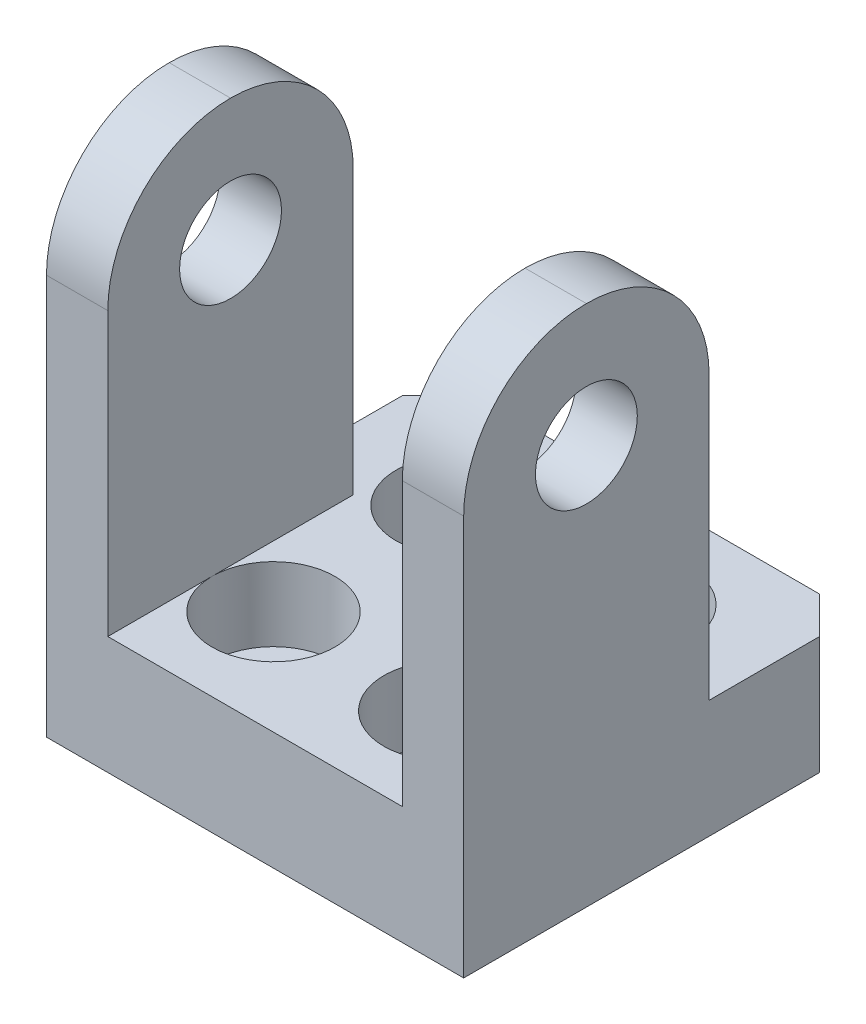
ISO-10303-21;
HEADER;
FILE_DESCRIPTION(('STEP AP214'),'2;1');
FILE_NAME('part.step','',(''),(''),'','','');
FILE_SCHEMA(('AUTOMOTIVE_DESIGN { 1 0 10303 214 1 1 1 1 }'));
ENDSEC;
DATA;
#1=APPLICATION_CONTEXT('core data for automotive mechanical design processes');
#2=APPLICATION_PROTOCOL_DEFINITION('international standard','automotive_design',2000,#1);
#3=PRODUCT_CONTEXT('',#1,'mechanical');
#4=PRODUCT('Part','Part','',(#3));
#5=PRODUCT_RELATED_PRODUCT_CATEGORY('part','',(#4));
#6=PRODUCT_DEFINITION_FORMATION('','',#4);
#7=PRODUCT_DEFINITION_CONTEXT('part definition',#1,'design');
#8=PRODUCT_DEFINITION('design','',#6,#7);
#9=PRODUCT_DEFINITION_SHAPE('','',#8);
#10=(LENGTH_UNIT() NAMED_UNIT(*) SI_UNIT(.MILLI.,.METRE.));
#11=(NAMED_UNIT(*) PLANE_ANGLE_UNIT() SI_UNIT($,.RADIAN.));
#12=(NAMED_UNIT(*) SI_UNIT($,.STERADIAN.) SOLID_ANGLE_UNIT());
#13=UNCERTAINTY_MEASURE_WITH_UNIT(LENGTH_MEASURE(1.E-05),#10,'distance_accuracy_value','');
#14=(GEOMETRIC_REPRESENTATION_CONTEXT(3) GLOBAL_UNCERTAINTY_ASSIGNED_CONTEXT((#13)) GLOBAL_UNIT_ASSIGNED_CONTEXT((#10,
#11,#12)) REPRESENTATION_CONTEXT('',''));
#15=CARTESIAN_POINT('',(0.,0.,0.));
#16=DIRECTION('',(0.,0.,1.));
#17=DIRECTION('',(1.,0.,0.));
#18=AXIS2_PLACEMENT_3D('',#15,#16,#17);
#19=CARTESIAN_POINT('',(7.,-33.,-13.5));
#20=DIRECTION('',(0.,1.,0.));
#21=DIRECTION('',(0.,0.,1.));
#22=AXIS2_PLACEMENT_3D('',#19,#20,#21);
#23=CYLINDRICAL_SURFACE('',#22,5.);
#24=CARTESIAN_POINT('',(7.,-39.,-13.5));
#25=DIRECTION('',(0.,1.,0.));
#26=DIRECTION('',(0.,0.,1.));
#27=AXIS2_PLACEMENT_3D('',#24,#25,#26);
#28=CIRCLE('',#27,5.);
#29=CARTESIAN_POINT('',(7.,-39.,-8.5));
#30=VERTEX_POINT('',#29);
#31=EDGE_CURVE('E11',#30,#30,#28,.T.);
#32=ORIENTED_EDGE('',*,*,#31,.F.);
#33=EDGE_LOOP('',(#32));
#34=FACE_BOUND('',#33,.T.);
#35=CARTESIAN_POINT('',(7.,-33.,-13.5));
#36=DIRECTION('',(0.,1.,0.));
#37=DIRECTION('',(0.,0.,1.));
#38=AXIS2_PLACEMENT_3D('',#35,#36,#37);
#39=CIRCLE('',#38,5.);
#40=CARTESIAN_POINT('',(7.,-33.,-8.5));
#41=VERTEX_POINT('',#40);
#42=EDGE_CURVE('E255',#41,#41,#39,.T.);
#43=ORIENTED_EDGE('',*,*,#42,.T.);
#44=EDGE_LOOP('',(#43));
#45=FACE_BOUND('',#44,.T.);
#46=ADVANCED_FACE('F17',(#34,#45),#23,.F.);
#47=CARTESIAN_POINT('',(9.75,-39.,-13.5));
#48=DIRECTION('',(0.,-1.,0.));
#49=DIRECTION('',(0.,0.,-1.));
#50=AXIS2_PLACEMENT_3D('',#47,#48,#49);
#51=PLANE('',#50);
#52=CARTESIAN_POINT('',(7.,-39.,-13.5));
#53=DIRECTION('',(0.,1.,0.));
#54=DIRECTION('',(0.,0.,1.));
#55=AXIS2_PLACEMENT_3D('',#52,#53,#54);
#56=CIRCLE('',#55,2.75);
#57=CARTESIAN_POINT('',(7.,-39.,-10.75));
#58=VERTEX_POINT('',#57);
#59=EDGE_CURVE('E20',#58,#58,#56,.T.);
#60=ORIENTED_EDGE('',*,*,#59,.F.);
#61=EDGE_LOOP('',(#60));
#62=FACE_BOUND('',#61,.T.);
#63=ORIENTED_EDGE('',*,*,#31,.T.);
#64=EDGE_LOOP('',(#63));
#65=FACE_BOUND('',#64,.T.);
#66=ADVANCED_FACE('F606',(#62,#65),#51,.F.);
#67=CARTESIAN_POINT('',(7.,-33.,-13.5));
#68=DIRECTION('',(0.,1.,0.));
#69=DIRECTION('',(0.,0.,1.));
#70=AXIS2_PLACEMENT_3D('',#67,#68,#69);
#71=CYLINDRICAL_SURFACE('',#70,2.75);
#72=CARTESIAN_POINT('',(7.,-42.6,-13.5));
#73=DIRECTION('',(0.,1.,0.));
#74=DIRECTION('',(0.,0.,1.));
#75=AXIS2_PLACEMENT_3D('',#72,#73,#74);
#76=CIRCLE('',#75,2.75);
#77=CARTESIAN_POINT('',(7.,-42.6,-10.75));
#78=VERTEX_POINT('',#77);
#79=EDGE_CURVE('E1041',#78,#78,#76,.T.);
#80=ORIENTED_EDGE('',*,*,#79,.F.);
#81=EDGE_LOOP('',(#80));
#82=FACE_BOUND('',#81,.T.);
#83=ORIENTED_EDGE('',*,*,#59,.T.);
#84=EDGE_LOOP('',(#83));
#85=FACE_BOUND('',#84,.T.);
#86=ADVANCED_FACE('F596',(#82,#85),#71,.F.);
#87=CARTESIAN_POINT('',(-7.,-33.,-13.5));
#88=DIRECTION('',(0.,1.,0.));
#89=DIRECTION('',(0.,0.,1.));
#90=AXIS2_PLACEMENT_3D('',#87,#88,#89);
#91=CYLINDRICAL_SURFACE('',#90,5.);
#92=CARTESIAN_POINT('',(-7.,-39.,-13.5));
#93=DIRECTION('',(0.,1.,0.));
#94=DIRECTION('',(0.,0.,1.));
#95=AXIS2_PLACEMENT_3D('',#92,#93,#94);
#96=CIRCLE('',#95,5.);
#97=CARTESIAN_POINT('',(-7.,-39.,-8.5));
#98=VERTEX_POINT('',#97);
#99=EDGE_CURVE('E284',#98,#98,#96,.T.);
#100=ORIENTED_EDGE('',*,*,#99,.F.);
#101=EDGE_LOOP('',(#100));
#102=FACE_BOUND('',#101,.T.);
#103=CARTESIAN_POINT('',(-7.,-33.,-13.5));
#104=DIRECTION('',(0.,1.,0.));
#105=DIRECTION('',(0.,0.,1.));
#106=AXIS2_PLACEMENT_3D('',#103,#104,#105);
#107=CIRCLE('',#106,5.);
#108=CARTESIAN_POINT('',(-7.,-33.,-8.5));
#109=VERTEX_POINT('',#108);
#110=EDGE_CURVE('E258',#109,#109,#107,.T.);
#111=ORIENTED_EDGE('',*,*,#110,.T.);
#112=EDGE_LOOP('',(#111));
#113=FACE_BOUND('',#112,.T.);
#114=ADVANCED_FACE('F585',(#102,#113),#91,.F.);
#115=CARTESIAN_POINT('',(-4.25,-39.,-13.5));
#116=DIRECTION('',(0.,-1.,0.));
#117=DIRECTION('',(0.,0.,-1.));
#118=AXIS2_PLACEMENT_3D('',#115,#116,#117);
#119=PLANE('',#118);
#120=CARTESIAN_POINT('',(-7.,-39.,-13.5));
#121=DIRECTION('',(0.,1.,0.));
#122=DIRECTION('',(0.,0.,1.));
#123=AXIS2_PLACEMENT_3D('',#120,#121,#122);
#124=CIRCLE('',#123,2.75);
#125=CARTESIAN_POINT('',(-7.,-39.,-10.75));
#126=VERTEX_POINT('',#125);
#127=EDGE_CURVE('E282',#126,#126,#124,.T.);
#128=ORIENTED_EDGE('',*,*,#127,.F.);
#129=EDGE_LOOP('',(#128));
#130=FACE_BOUND('',#129,.T.);
#131=ORIENTED_EDGE('',*,*,#99,.T.);
#132=EDGE_LOOP('',(#131));
#133=FACE_BOUND('',#132,.T.);
#134=ADVANCED_FACE('F575',(#130,#133),#119,.F.);
#135=CARTESIAN_POINT('',(-7.,-33.,-13.5));
#136=DIRECTION('',(0.,1.,0.));
#137=DIRECTION('',(0.,0.,1.));
#138=AXIS2_PLACEMENT_3D('',#135,#136,#137);
#139=CYLINDRICAL_SURFACE('',#138,2.75);
#140=CARTESIAN_POINT('',(-7.,-42.6,-13.5));
#141=DIRECTION('',(0.,1.,0.));
#142=DIRECTION('',(0.,0.,1.));
#143=AXIS2_PLACEMENT_3D('',#140,#141,#142);
#144=CIRCLE('',#143,2.75);
#145=CARTESIAN_POINT('',(-7.,-42.6,-10.75));
#146=VERTEX_POINT('',#145);
#147=EDGE_CURVE('E1037',#146,#146,#144,.T.);
#148=ORIENTED_EDGE('',*,*,#147,.F.);
#149=EDGE_LOOP('',(#148));
#150=FACE_BOUND('',#149,.T.);
#151=ORIENTED_EDGE('',*,*,#127,.T.);
#152=EDGE_LOOP('',(#151));
#153=FACE_BOUND('',#152,.T.);
#154=ADVANCED_FACE('F564',(#150,#153),#139,.F.);
#155=CARTESIAN_POINT('',(7.,-33.,1.5));
#156=DIRECTION('',(0.,1.,0.));
#157=DIRECTION('',(0.,0.,1.));
#158=AXIS2_PLACEMENT_3D('',#155,#156,#157);
#159=CYLINDRICAL_SURFACE('',#158,5.);
#160=CARTESIAN_POINT('',(7.,-39.,1.5));
#161=DIRECTION('',(0.,1.,0.));
#162=DIRECTION('',(0.,0.,1.));
#163=AXIS2_PLACEMENT_3D('',#160,#161,#162);
#164=CIRCLE('',#163,5.);
#165=CARTESIAN_POINT('',(7.,-39.,6.5));
#166=VERTEX_POINT('',#165);
#167=EDGE_CURVE('E281',#166,#166,#164,.T.);
#168=ORIENTED_EDGE('',*,*,#167,.F.);
#169=EDGE_LOOP('',(#168));
#170=FACE_BOUND('',#169,.T.);
#171=CARTESIAN_POINT('',(7.,-33.,1.5));
#172=DIRECTION('',(0.,1.,0.));
#173=DIRECTION('',(0.,0.,1.));
#174=AXIS2_PLACEMENT_3D('',#171,#172,#173);
#175=CIRCLE('',#174,5.);
#176=CARTESIAN_POINT('',(12.,-33.,1.5));
#177=VERTEX_POINT('',#176);
#178=EDGE_CURVE('E235',#177,#177,#175,.T.);
#179=ORIENTED_EDGE('',*,*,#178,.T.);
#180=EDGE_LOOP('',(#179));
#181=FACE_BOUND('',#180,.T.);
#182=ADVANCED_FACE('F553',(#170,#181),#159,.F.);
#183=CARTESIAN_POINT('',(9.75,-39.,1.5));
#184=DIRECTION('',(0.,-1.,0.));
#185=DIRECTION('',(0.,0.,-1.));
#186=AXIS2_PLACEMENT_3D('',#183,#184,#185);
#187=PLANE('',#186);
#188=CARTESIAN_POINT('',(7.,-39.,1.5));
#189=DIRECTION('',(0.,1.,0.));
#190=DIRECTION('',(0.,0.,1.));
#191=AXIS2_PLACEMENT_3D('',#188,#189,#190);
#192=CIRCLE('',#191,2.75);
#193=CARTESIAN_POINT('',(7.,-39.,4.25));
#194=VERTEX_POINT('',#193);
#195=EDGE_CURVE('E278',#194,#194,#192,.T.);
#196=ORIENTED_EDGE('',*,*,#195,.F.);
#197=EDGE_LOOP('',(#196));
#198=FACE_BOUND('',#197,.T.);
#199=ORIENTED_EDGE('',*,*,#167,.T.);
#200=EDGE_LOOP('',(#199));
#201=FACE_BOUND('',#200,.T.);
#202=ADVANCED_FACE('F542',(#198,#201),#187,.F.);
#203=CARTESIAN_POINT('',(7.,-33.,1.5));
#204=DIRECTION('',(0.,1.,0.));
#205=DIRECTION('',(0.,0.,1.));
#206=AXIS2_PLACEMENT_3D('',#203,#204,#205);
#207=CYLINDRICAL_SURFACE('',#206,2.75);
#208=CARTESIAN_POINT('',(7.,-42.6,1.5));
#209=DIRECTION('',(0.,1.,0.));
#210=DIRECTION('',(0.,0.,1.));
#211=AXIS2_PLACEMENT_3D('',#208,#209,#210);
#212=CIRCLE('',#211,2.75);
#213=CARTESIAN_POINT('',(7.,-42.6,4.25));
#214=VERTEX_POINT('',#213);
#215=EDGE_CURVE('E1024',#214,#214,#212,.T.);
#216=ORIENTED_EDGE('',*,*,#215,.F.);
#217=EDGE_LOOP('',(#216));
#218=FACE_BOUND('',#217,.T.);
#219=ORIENTED_EDGE('',*,*,#195,.T.);
#220=EDGE_LOOP('',(#219));
#221=FACE_BOUND('',#220,.T.);
#222=ADVANCED_FACE('F531',(#218,#221),#207,.F.);
#223=CARTESIAN_POINT('',(-7.,-33.,1.5));
#224=DIRECTION('',(0.,1.,0.));
#225=DIRECTION('',(0.,0.,1.));
#226=AXIS2_PLACEMENT_3D('',#223,#224,#225);
#227=CYLINDRICAL_SURFACE('',#226,5.);
#228=CARTESIAN_POINT('',(-7.,-39.,1.5));
#229=DIRECTION('',(0.,1.,0.));
#230=DIRECTION('',(0.,0.,1.));
#231=AXIS2_PLACEMENT_3D('',#228,#229,#230);
#232=CIRCLE('',#231,5.);
#233=CARTESIAN_POINT('',(-7.,-39.,6.5));
#234=VERTEX_POINT('',#233);
#235=EDGE_CURVE('E275',#234,#234,#232,.T.);
#236=ORIENTED_EDGE('',*,*,#235,.F.);
#237=EDGE_LOOP('',(#236));
#238=FACE_BOUND('',#237,.T.);
#239=CARTESIAN_POINT('',(-7.,-33.,1.5));
#240=DIRECTION('',(0.,1.,0.));
#241=DIRECTION('',(0.,0.,1.));
#242=AXIS2_PLACEMENT_3D('',#239,#240,#241);
#243=CIRCLE('',#242,5.);
#244=CARTESIAN_POINT('',(-12.,-33.,1.5));
#245=VERTEX_POINT('',#244);
#246=EDGE_CURVE('E259',#245,#245,#243,.T.);
#247=ORIENTED_EDGE('',*,*,#246,.T.);
#248=EDGE_LOOP('',(#247));
#249=FACE_BOUND('',#248,.T.);
#250=ADVANCED_FACE('F520',(#238,#249),#227,.F.);
#251=CARTESIAN_POINT('',(-4.25,-39.,1.5));
#252=DIRECTION('',(0.,-1.,0.));
#253=DIRECTION('',(0.,0.,-1.));
#254=AXIS2_PLACEMENT_3D('',#251,#252,#253);
#255=PLANE('',#254);
#256=CARTESIAN_POINT('',(-7.,-39.,1.5));
#257=DIRECTION('',(0.,1.,0.));
#258=DIRECTION('',(0.,0.,1.));
#259=AXIS2_PLACEMENT_3D('',#256,#257,#258);
#260=CIRCLE('',#259,2.75);
#261=CARTESIAN_POINT('',(-7.,-39.,4.25));
#262=VERTEX_POINT('',#261);
#263=EDGE_CURVE('E272',#262,#262,#260,.T.);
#264=ORIENTED_EDGE('',*,*,#263,.F.);
#265=EDGE_LOOP('',(#264));
#266=FACE_BOUND('',#265,.T.);
#267=ORIENTED_EDGE('',*,*,#235,.T.);
#268=EDGE_LOOP('',(#267));
#269=FACE_BOUND('',#268,.T.);
#270=ADVANCED_FACE('F509',(#266,#269),#255,.F.);
#271=CARTESIAN_POINT('',(-7.,-33.,1.5));
#272=DIRECTION('',(0.,1.,0.));
#273=DIRECTION('',(0.,0.,1.));
#274=AXIS2_PLACEMENT_3D('',#271,#272,#273);
#275=CYLINDRICAL_SURFACE('',#274,2.75);
#276=CARTESIAN_POINT('',(-7.,-42.6,1.5));
#277=DIRECTION('',(0.,1.,0.));
#278=DIRECTION('',(0.,0.,1.));
#279=AXIS2_PLACEMENT_3D('',#276,#277,#278);
#280=CIRCLE('',#279,2.75);
#281=CARTESIAN_POINT('',(-7.,-42.6,4.25));
#282=VERTEX_POINT('',#281);
#283=EDGE_CURVE('E1017',#282,#282,#280,.T.);
#284=ORIENTED_EDGE('',*,*,#283,.F.);
#285=EDGE_LOOP('',(#284));
#286=FACE_BOUND('',#285,.T.);
#287=ORIENTED_EDGE('',*,*,#263,.T.);
#288=EDGE_LOOP('',(#287));
#289=FACE_BOUND('',#288,.T.);
#290=ADVANCED_FACE('F498',(#286,#289),#275,.F.);
#291=CARTESIAN_POINT('',(-17.,-42.6,-19.));
#292=DIRECTION('',(0.707106781186546,0.,0.707106781186549));
#293=DIRECTION('',(0.,-1.,0.));
#294=AXIS2_PLACEMENT_3D('',#291,#292,#293);
#295=PLANE('',#294);
#296=DIRECTION('',(-0.707106781186549,0.,0.707106781186546));
#297=VECTOR('',#296,1.);
#298=CARTESIAN_POINT('',(-18.,-33.,-18.));
#299=LINE('',#298,#297);
#300=CARTESIAN_POINT('',(-14.,-33.,-22.));
#301=VERTEX_POINT('',#300);
#302=CARTESIAN_POINT('',(-17.,-33.,-19.));
#303=VERTEX_POINT('',#302);
#304=EDGE_CURVE('E254',#301,#303,#299,.T.);
#305=ORIENTED_EDGE('',*,*,#304,.F.);
#306=DIRECTION('',(0.,1.,0.));
#307=VECTOR('',#306,1.);
#308=CARTESIAN_POINT('',(-14.,13.690470119715,-22.));
#309=LINE('',#308,#307);
#310=CARTESIAN_POINT('',(-14.,-42.6,-22.));
#311=VERTEX_POINT('',#310);
#312=EDGE_CURVE('E269',#311,#301,#309,.T.);
#313=ORIENTED_EDGE('',*,*,#312,.F.);
#314=DIRECTION('',(0.707106781186549,0.,-0.707106781186546));
#315=VECTOR('',#314,1.);
#316=CARTESIAN_POINT('',(-17.,-42.6,-19.));
#317=LINE('',#316,#315);
#318=CARTESIAN_POINT('',(-17.,-42.6,-19.));
#319=VERTEX_POINT('',#318);
#320=EDGE_CURVE('E1045',#319,#311,#317,.T.);
#321=ORIENTED_EDGE('',*,*,#320,.F.);
#322=DIRECTION('',(0.,-1.,0.));
#323=VECTOR('',#322,1.);
#324=CARTESIAN_POINT('',(-17.,-42.6,-19.));
#325=LINE('',#324,#323);
#326=EDGE_CURVE('E1248',#303,#319,#325,.T.);
#327=ORIENTED_EDGE('',*,*,#326,.F.);
#328=EDGE_LOOP('',(#305,#313,#321,#327));
#329=FACE_BOUND('',#328,.T.);
#330=ADVANCED_FACE('F488',(#329),#295,.F.);
#331=CARTESIAN_POINT('',(14.,13.690470119715,-22.));
#332=DIRECTION('',(-0.707106781186549,0.,0.707106781186546));
#333=DIRECTION('',(0.,1.,0.));
#334=AXIS2_PLACEMENT_3D('',#331,#332,#333);
#335=PLANE('',#334);
#336=DIRECTION('',(-0.707106781186546,0.,-0.707106781186549));
#337=VECTOR('',#336,1.);
#338=CARTESIAN_POINT('',(18.,-33.,-18.));
#339=LINE('',#338,#337);
#340=CARTESIAN_POINT('',(17.,-33.,-19.));
#341=VERTEX_POINT('',#340);
#342=CARTESIAN_POINT('',(14.,-33.,-22.));
#343=VERTEX_POINT('',#342);
#344=EDGE_CURVE('E243',#341,#343,#339,.T.);
#345=ORIENTED_EDGE('',*,*,#344,.F.);
#346=DIRECTION('',(0.,1.,0.));
#347=VECTOR('',#346,1.);
#348=CARTESIAN_POINT('',(17.,-42.6,-19.));
#349=LINE('',#348,#347);
#350=CARTESIAN_POINT('',(17.,-42.6,-19.));
#351=VERTEX_POINT('',#350);
#352=EDGE_CURVE('E1157',#351,#341,#349,.T.);
#353=ORIENTED_EDGE('',*,*,#352,.F.);
#354=DIRECTION('',(0.707106781186546,0.,0.707106781186549));
#355=VECTOR('',#354,1.);
#356=CARTESIAN_POINT('',(14.,-42.6,-22.));
#357=LINE('',#356,#355);
#358=CARTESIAN_POINT('',(14.,-42.6,-22.));
#359=VERTEX_POINT('',#358);
#360=EDGE_CURVE('E1049',#359,#351,#357,.T.);
#361=ORIENTED_EDGE('',*,*,#360,.F.);
#362=DIRECTION('',(0.,-1.,0.));
#363=VECTOR('',#362,1.);
#364=CARTESIAN_POINT('',(14.,13.690470119715,-22.));
#365=LINE('',#364,#363);
#366=EDGE_CURVE('E266',#343,#359,#365,.T.);
#367=ORIENTED_EDGE('',*,*,#366,.F.);
#368=EDGE_LOOP('',(#345,#353,#361,#367));
#369=FACE_BOUND('',#368,.T.);
#370=ADVANCED_FACE('F477',(#369),#335,.F.);
#371=CARTESIAN_POINT('',(-17.,13.690470119715,-22.));
#372=DIRECTION('',(0.,0.,-1.));
#373=DIRECTION('',(0.,-1.,0.));
#374=AXIS2_PLACEMENT_3D('',#371,#372,#373);
#375=PLANE('',#374);
#376=DIRECTION('',(1.,0.,0.));
#377=VECTOR('',#376,1.);
#378=CARTESIAN_POINT('',(-17.,-33.,-22.));
#379=LINE('',#378,#377);
#380=EDGE_CURVE('E250',#301,#343,#379,.T.);
#381=ORIENTED_EDGE('',*,*,#380,.T.);
#382=ORIENTED_EDGE('',*,*,#366,.T.);
#383=DIRECTION('',(1.,0.,0.));
#384=VECTOR('',#383,1.);
#385=CARTESIAN_POINT('',(-17.,-42.6,-22.));
#386=LINE('',#385,#384);
#387=EDGE_CURVE('E1053',#311,#359,#386,.T.);
#388=ORIENTED_EDGE('',*,*,#387,.F.);
#389=ORIENTED_EDGE('',*,*,#312,.T.);
#390=EDGE_LOOP('',(#381,#382,#388,#389));
#391=FACE_BOUND('',#390,.T.);
#392=ADVANCED_FACE('F466',(#391),#375,.T.);
#393=CARTESIAN_POINT('',(0.,-10.,0.));
#394=DIRECTION('',(1.,0.,0.));
#395=DIRECTION('',(0.,0.,-1.));
#396=AXIS2_PLACEMENT_3D('',#393,#394,#395);
#397=CYLINDRICAL_SURFACE('',#396,10.);
#398=CARTESIAN_POINT('',(-17.,-10.,0.));
#399=DIRECTION('',(-1.,0.,0.));
#400=DIRECTION('',(0.,0.,1.));
#401=AXIS2_PLACEMENT_3D('',#398,#399,#400);
#402=CIRCLE('',#401,10.);
#403=CARTESIAN_POINT('',(-17.,-10.,10.));
#404=VERTEX_POINT('',#403);
#405=CARTESIAN_POINT('',(-17.,0.,0.));
#406=VERTEX_POINT('',#405);
#407=EDGE_CURVE('E1224',#404,#406,#402,.T.);
#408=ORIENTED_EDGE('',*,*,#407,.F.);
#409=DIRECTION('',(-1.,0.,0.));
#410=VECTOR('',#409,1.);
#411=CARTESIAN_POINT('',(17.,-10.,10.));
#412=LINE('',#411,#410);
#413=CARTESIAN_POINT('',(-12.,-10.,10.));
#414=VERTEX_POINT('',#413);
#415=EDGE_CURVE('E1095',#414,#404,#412,.T.);
#416=ORIENTED_EDGE('',*,*,#415,.F.);
#417=CARTESIAN_POINT('',(-12.,-10.,0.));
#418=DIRECTION('',(1.,0.,0.));
#419=DIRECTION('',(0.,0.,1.));
#420=AXIS2_PLACEMENT_3D('',#417,#418,#419);
#421=CIRCLE('',#420,10.);
#422=CARTESIAN_POINT('',(-12.,0.,0.));
#423=VERTEX_POINT('',#422);
#424=EDGE_CURVE('E1002',#423,#414,#421,.T.);
#425=ORIENTED_EDGE('',*,*,#424,.F.);
#426=DIRECTION('',(-1.,0.,0.));
#427=VECTOR('',#426,1.);
#428=CARTESIAN_POINT('',(0.,0.,0.));
#429=LINE('',#428,#427);
#430=EDGE_CURVE('E262',#423,#406,#429,.T.);
#431=ORIENTED_EDGE('',*,*,#430,.T.);
#432=EDGE_LOOP('',(#408,#416,#425,#431));
#433=FACE_BOUND('',#432,.T.);
#434=ADVANCED_FACE('F455',(#433),#397,.T.);
#435=CARTESIAN_POINT('',(0.,-10.,0.));
#436=DIRECTION('',(1.,0.,0.));
#437=DIRECTION('',(0.,0.,-1.));
#438=AXIS2_PLACEMENT_3D('',#435,#436,#437);
#439=CYLINDRICAL_SURFACE('',#438,10.);
#440=CARTESIAN_POINT('',(12.,-10.,0.));
#441=DIRECTION('',(-1.,0.,0.));
#442=DIRECTION('',(0.,0.,-1.));
#443=AXIS2_PLACEMENT_3D('',#440,#441,#442);
#444=CIRCLE('',#443,10.);
#445=CARTESIAN_POINT('',(12.,-10.,10.));
#446=VERTEX_POINT('',#445);
#447=CARTESIAN_POINT('',(12.,0.,0.));
#448=VERTEX_POINT('',#447);
#449=EDGE_CURVE('E985',#446,#448,#444,.T.);
#450=ORIENTED_EDGE('',*,*,#449,.F.);
#451=DIRECTION('',(-1.,0.,0.));
#452=VECTOR('',#451,1.);
#453=CARTESIAN_POINT('',(17.,-10.,10.));
#454=LINE('',#453,#452);
#455=CARTESIAN_POINT('',(17.,-10.,10.));
#456=VERTEX_POINT('',#455);
#457=EDGE_CURVE('E1077',#456,#446,#454,.T.);
#458=ORIENTED_EDGE('',*,*,#457,.F.);
#459=CARTESIAN_POINT('',(17.,-10.,0.));
#460=DIRECTION('',(1.,0.,0.));
#461=DIRECTION('',(0.,0.,-1.));
#462=AXIS2_PLACEMENT_3D('',#459,#460,#461);
#463=CIRCLE('',#462,10.);
#464=CARTESIAN_POINT('',(17.,0.,0.));
#465=VERTEX_POINT('',#464);
#466=EDGE_CURVE('E1121',#465,#456,#463,.T.);
#467=ORIENTED_EDGE('',*,*,#466,.F.);
#468=DIRECTION('',(-1.,0.,0.));
#469=VECTOR('',#468,1.);
#470=CARTESIAN_POINT('',(0.,0.,0.));
#471=LINE('',#470,#469);
#472=EDGE_CURVE('E263',#465,#448,#471,.T.);
#473=ORIENTED_EDGE('',*,*,#472,.T.);
#474=EDGE_LOOP('',(#450,#458,#467,#473));
#475=FACE_BOUND('',#474,.T.);
#476=ADVANCED_FACE('F445',(#475),#439,.T.);
#477=CARTESIAN_POINT('',(0.,-10.,0.));
#478=DIRECTION('',(-1.,0.,0.));
#479=DIRECTION('',(0.,0.,1.));
#480=AXIS2_PLACEMENT_3D('',#477,#478,#479);
#481=CYLINDRICAL_SURFACE('',#480,10.);
#482=DIRECTION('',(1.,0.,0.));
#483=VECTOR('',#482,1.);
#484=CARTESIAN_POINT('',(17.,-10.,-10.));
#485=LINE('',#484,#483);
#486=CARTESIAN_POINT('',(12.,-10.,-10.));
#487=VERTEX_POINT('',#486);
#488=CARTESIAN_POINT('',(17.,-10.,-10.));
#489=VERTEX_POINT('',#488);
#490=EDGE_CURVE('E1173',#487,#489,#485,.T.);
#491=ORIENTED_EDGE('',*,*,#490,.F.);
#492=CARTESIAN_POINT('',(12.,-10.,0.));
#493=DIRECTION('',(-1.,0.,0.));
#494=DIRECTION('',(0.,0.,-1.));
#495=AXIS2_PLACEMENT_3D('',#492,#493,#494);
#496=CIRCLE('',#495,10.);
#497=EDGE_CURVE('E979',#448,#487,#496,.T.);
#498=ORIENTED_EDGE('',*,*,#497,.F.);
#499=ORIENTED_EDGE('',*,*,#472,.F.);
#500=CARTESIAN_POINT('',(17.,-10.,0.));
#501=DIRECTION('',(1.,0.,0.));
#502=DIRECTION('',(0.,0.,-1.));
#503=AXIS2_PLACEMENT_3D('',#500,#501,#502);
#504=CIRCLE('',#503,10.);
#505=EDGE_CURVE('E1142',#489,#465,#504,.T.);
#506=ORIENTED_EDGE('',*,*,#505,.F.);
#507=EDGE_LOOP('',(#491,#498,#499,#506));
#508=FACE_BOUND('',#507,.T.);
#509=ADVANCED_FACE('F435',(#508),#481,.T.);
#510=CARTESIAN_POINT('',(0.,-10.,0.));
#511=DIRECTION('',(-1.,0.,0.));
#512=DIRECTION('',(0.,0.,1.));
#513=AXIS2_PLACEMENT_3D('',#510,#511,#512);
#514=CYLINDRICAL_SURFACE('',#513,10.);
#515=CARTESIAN_POINT('',(-12.,-10.,0.));
#516=DIRECTION('',(1.,0.,0.));
#517=DIRECTION('',(0.,0.,1.));
#518=AXIS2_PLACEMENT_3D('',#515,#516,#517);
#519=CIRCLE('',#518,10.);
#520=CARTESIAN_POINT('',(-12.,-10.,-10.));
#521=VERTEX_POINT('',#520);
#522=EDGE_CURVE('E1009',#521,#423,#519,.T.);
#523=ORIENTED_EDGE('',*,*,#522,.F.);
#524=DIRECTION('',(1.,0.,0.));
#525=VECTOR('',#524,1.);
#526=CARTESIAN_POINT('',(17.,-10.,-10.));
#527=LINE('',#526,#525);
#528=CARTESIAN_POINT('',(-17.,-10.,-10.));
#529=VERTEX_POINT('',#528);
#530=EDGE_CURVE('E1272',#529,#521,#527,.T.);
#531=ORIENTED_EDGE('',*,*,#530,.F.);
#532=CARTESIAN_POINT('',(-17.,-10.,0.));
#533=DIRECTION('',(-1.,0.,0.));
#534=DIRECTION('',(0.,0.,1.));
#535=AXIS2_PLACEMENT_3D('',#532,#533,#534);
#536=CIRCLE('',#535,10.);
#537=EDGE_CURVE('E1220',#406,#529,#536,.T.);
#538=ORIENTED_EDGE('',*,*,#537,.F.);
#539=ORIENTED_EDGE('',*,*,#430,.F.);
#540=EDGE_LOOP('',(#523,#531,#538,#539));
#541=FACE_BOUND('',#540,.T.);
#542=ADVANCED_FACE('F423',(#541),#514,.T.);
#543=CARTESIAN_POINT('',(-17.,-10.,0.));
#544=DIRECTION('',(1.,0.,0.));
#545=DIRECTION('',(0.,0.,-1.));
#546=AXIS2_PLACEMENT_3D('',#543,#544,#545);
#547=CYLINDRICAL_SURFACE('',#546,4.15);
#548=CARTESIAN_POINT('',(-17.,-10.,0.));
#549=DIRECTION('',(1.,0.,0.));
#550=DIRECTION('',(0.,0.,-1.));
#551=AXIS2_PLACEMENT_3D('',#548,#549,#550);
#552=CIRCLE('',#551,4.15);
#553=CARTESIAN_POINT('',(-17.,-10.,-4.15));
#554=VERTEX_POINT('',#553);
#555=EDGE_CURVE('E1216',#554,#554,#552,.T.);
#556=ORIENTED_EDGE('',*,*,#555,.F.);
#557=EDGE_LOOP('',(#556));
#558=FACE_BOUND('',#557,.T.);
#559=CARTESIAN_POINT('',(-12.,-10.,0.));
#560=DIRECTION('',(-1.,0.,0.));
#561=DIRECTION('',(0.,0.,1.));
#562=AXIS2_PLACEMENT_3D('',#559,#560,#561);
#563=CIRCLE('',#562,4.15);
#564=CARTESIAN_POINT('',(-12.,-10.,4.15));
#565=VERTEX_POINT('',#564);
#566=EDGE_CURVE('E993',#565,#565,#563,.T.);
#567=ORIENTED_EDGE('',*,*,#566,.F.);
#568=EDGE_LOOP('',(#567));
#569=FACE_BOUND('',#568,.T.);
#570=ADVANCED_FACE('F412',(#558,#569),#547,.F.);
#571=CARTESIAN_POINT('',(-17.,-10.,0.));
#572=DIRECTION('',(1.,0.,0.));
#573=DIRECTION('',(0.,0.,-1.));
#574=AXIS2_PLACEMENT_3D('',#571,#572,#573);
#575=CYLINDRICAL_SURFACE('',#574,4.15);
#576=CARTESIAN_POINT('',(17.,-10.,0.));
#577=DIRECTION('',(1.,0.,0.));
#578=DIRECTION('',(0.,0.,-1.));
#579=AXIS2_PLACEMENT_3D('',#576,#577,#578);
#580=CIRCLE('',#579,4.15);
#581=CARTESIAN_POINT('',(17.,-10.,-4.15));
#582=VERTEX_POINT('',#581);
#583=EDGE_CURVE('E1099',#582,#582,#580,.T.);
#584=ORIENTED_EDGE('',*,*,#583,.T.);
#585=EDGE_LOOP('',(#584));
#586=FACE_BOUND('',#585,.T.);
#587=CARTESIAN_POINT('',(12.,-10.,0.));
#588=DIRECTION('',(1.,0.,0.));
#589=DIRECTION('',(0.,0.,-1.));
#590=AXIS2_PLACEMENT_3D('',#587,#588,#589);
#591=CIRCLE('',#590,4.15);
#592=CARTESIAN_POINT('',(12.,-10.,-4.15));
#593=VERTEX_POINT('',#592);
#594=EDGE_CURVE('E230',#593,#593,#591,.T.);
#595=ORIENTED_EDGE('',*,*,#594,.F.);
#596=EDGE_LOOP('',(#595));
#597=FACE_BOUND('',#596,.T.);
#598=ADVANCED_FACE('F402',(#586,#597),#575,.F.);
#599=CARTESIAN_POINT('',(0.,-33.,0.));
#600=DIRECTION('',(0.,1.,0.));
#601=DIRECTION('',(1.,0.,0.));
#602=AXIS2_PLACEMENT_3D('',#599,#600,#601);
#603=PLANE('',#602);
#604=ORIENTED_EDGE('',*,*,#110,.F.);
#605=EDGE_LOOP('',(#604));
#606=FACE_BOUND('',#605,.T.);
#607=ORIENTED_EDGE('',*,*,#42,.F.);
#608=EDGE_LOOP('',(#607));
#609=FACE_BOUND('',#608,.T.);
#610=DIRECTION('',(0.,0.,-1.));
#611=VECTOR('',#610,1.);
#612=CARTESIAN_POINT('',(12.,-33.,10.));
#613=LINE('',#612,#611);
#614=CARTESIAN_POINT('',(12.,-33.,10.));
#615=VERTEX_POINT('',#614);
#616=EDGE_CURVE('E236',#615,#177,#613,.T.);
#617=ORIENTED_EDGE('',*,*,#616,.T.);
#618=ORIENTED_EDGE('',*,*,#178,.F.);
#619=DIRECTION('',(0.,0.,-1.));
#620=VECTOR('',#619,1.);
#621=CARTESIAN_POINT('',(12.,-33.,10.));
#622=LINE('',#621,#620);
#623=CARTESIAN_POINT('',(12.,-33.,-10.));
#624=VERTEX_POINT('',#623);
#625=EDGE_CURVE('E246',#177,#624,#622,.T.);
#626=ORIENTED_EDGE('',*,*,#625,.T.);
#627=DIRECTION('',(1.,0.,0.));
#628=VECTOR('',#627,1.);
#629=CARTESIAN_POINT('',(17.,-33.,-10.));
#630=LINE('',#629,#628);
#631=CARTESIAN_POINT('',(17.,-33.,-10.));
#632=VERTEX_POINT('',#631);
#633=EDGE_CURVE('E1188',#624,#632,#630,.T.);
#634=ORIENTED_EDGE('',*,*,#633,.T.);
#635=DIRECTION('',(0.,0.,1.));
#636=VECTOR('',#635,1.);
#637=CARTESIAN_POINT('',(17.,-33.,10.));
#638=LINE('',#637,#636);
#639=EDGE_CURVE('E1150',#341,#632,#638,.T.);
#640=ORIENTED_EDGE('',*,*,#639,.F.);
#641=ORIENTED_EDGE('',*,*,#344,.T.);
#642=ORIENTED_EDGE('',*,*,#380,.F.);
#643=ORIENTED_EDGE('',*,*,#304,.T.);
#644=DIRECTION('',(0.,0.,-1.));
#645=VECTOR('',#644,1.);
#646=CARTESIAN_POINT('',(-17.,-33.,10.));
#647=LINE('',#646,#645);
#648=CARTESIAN_POINT('',(-17.,-33.,-10.));
#649=VERTEX_POINT('',#648);
#650=EDGE_CURVE('E1252',#649,#303,#647,.T.);
#651=ORIENTED_EDGE('',*,*,#650,.F.);
#652=DIRECTION('',(1.,0.,0.));
#653=VECTOR('',#652,1.);
#654=CARTESIAN_POINT('',(17.,-33.,-10.));
#655=LINE('',#654,#653);
#656=CARTESIAN_POINT('',(-12.,-33.,-10.));
#657=VERTEX_POINT('',#656);
#658=EDGE_CURVE('E1308',#649,#657,#655,.T.);
#659=ORIENTED_EDGE('',*,*,#658,.T.);
#660=DIRECTION('',(0.,0.,1.));
#661=VECTOR('',#660,1.);
#662=CARTESIAN_POINT('',(-12.,-33.,10.));
#663=LINE('',#662,#661);
#664=EDGE_CURVE('E1001',#657,#245,#663,.T.);
#665=ORIENTED_EDGE('',*,*,#664,.T.);
#666=ORIENTED_EDGE('',*,*,#246,.F.);
#667=DIRECTION('',(0.,0.,1.));
#668=VECTOR('',#667,1.);
#669=CARTESIAN_POINT('',(-12.,-33.,10.));
#670=LINE('',#669,#668);
#671=CARTESIAN_POINT('',(-12.,-33.,10.));
#672=VERTEX_POINT('',#671);
#673=EDGE_CURVE('E997',#245,#672,#670,.T.);
#674=ORIENTED_EDGE('',*,*,#673,.T.);
#675=DIRECTION('',(1.,0.,0.));
#676=VECTOR('',#675,1.);
#677=CARTESIAN_POINT('',(12.,-33.,10.));
#678=LINE('',#677,#676);
#679=EDGE_CURVE('E1062',#672,#615,#678,.T.);
#680=ORIENTED_EDGE('',*,*,#679,.T.);
#681=EDGE_LOOP('',(#617,#618,#626,#634,#640,#641,#642,#643,#651,#659,#665,#666,#674,#680));
#682=FACE_BOUND('',#681,.T.);
#683=ADVANCED_FACE('F393',(#606,#609,#682),#603,.T.);
#684=CARTESIAN_POINT('',(12.,-33.,10.));
#685=DIRECTION('',(1.,0.,0.));
#686=DIRECTION('',(0.,1.,0.));
#687=AXIS2_PLACEMENT_3D('',#684,#685,#686);
#688=PLANE('',#687);
#689=ORIENTED_EDGE('',*,*,#594,.T.);
#690=EDGE_LOOP('',(#689));
#691=FACE_BOUND('',#690,.T.);
#692=DIRECTION('',(0.,1.,0.));
#693=VECTOR('',#692,1.);
#694=CARTESIAN_POINT('',(12.,-33.,10.));
#695=LINE('',#694,#693);
#696=EDGE_CURVE('E1072',#615,#446,#695,.T.);
#697=ORIENTED_EDGE('',*,*,#696,.T.);
#698=ORIENTED_EDGE('',*,*,#449,.T.);
#699=ORIENTED_EDGE('',*,*,#497,.T.);
#700=DIRECTION('',(0.,1.,0.));
#701=VECTOR('',#700,1.);
#702=CARTESIAN_POINT('',(12.,-33.,-10.));
#703=LINE('',#702,#701);
#704=EDGE_CURVE('E1183',#624,#487,#703,.T.);
#705=ORIENTED_EDGE('',*,*,#704,.F.);
#706=ORIENTED_EDGE('',*,*,#625,.F.);
#707=ORIENTED_EDGE('',*,*,#616,.F.);
#708=EDGE_LOOP('',(#697,#698,#699,#705,#706,#707));
#709=FACE_BOUND('',#708,.T.);
#710=ADVANCED_FACE('F231',(#691,#709),#688,.F.);
#711=CARTESIAN_POINT('',(-12.,-33.,10.));
#712=DIRECTION('',(-1.,0.,0.));
#713=DIRECTION('',(0.,0.,1.));
#714=AXIS2_PLACEMENT_3D('',#711,#712,#713);
#715=PLANE('',#714);
#716=ORIENTED_EDGE('',*,*,#566,.T.);
#717=EDGE_LOOP('',(#716));
#718=FACE_BOUND('',#717,.T.);
#719=ORIENTED_EDGE('',*,*,#522,.T.);
#720=ORIENTED_EDGE('',*,*,#424,.T.);
#721=DIRECTION('',(0.,1.,0.));
#722=VECTOR('',#721,1.);
#723=CARTESIAN_POINT('',(-12.,-33.,10.));
#724=LINE('',#723,#722);
#725=EDGE_CURVE('E1057',#672,#414,#724,.T.);
#726=ORIENTED_EDGE('',*,*,#725,.F.);
#727=ORIENTED_EDGE('',*,*,#673,.F.);
#728=ORIENTED_EDGE('',*,*,#664,.F.);
#729=DIRECTION('',(0.,1.,0.));
#730=VECTOR('',#729,1.);
#731=CARTESIAN_POINT('',(-12.,-33.,-10.));
#732=LINE('',#731,#730);
#733=EDGE_CURVE('E1257',#657,#521,#732,.T.);
#734=ORIENTED_EDGE('',*,*,#733,.T.);
#735=EDGE_LOOP('',(#719,#720,#726,#727,#728,#734));
#736=FACE_BOUND('',#735,.T.);
#737=ADVANCED_FACE('F371',(#718,#736),#715,.F.);
#738=CARTESIAN_POINT('',(0.,-42.6,0.));
#739=DIRECTION('',(0.,1.,0.));
#740=DIRECTION('',(1.,0.,0.));
#741=AXIS2_PLACEMENT_3D('',#738,#739,#740);
#742=PLANE('',#741);
#743=ORIENTED_EDGE('',*,*,#283,.T.);
#744=EDGE_LOOP('',(#743));
#745=FACE_BOUND('',#744,.T.);
#746=ORIENTED_EDGE('',*,*,#215,.T.);
#747=EDGE_LOOP('',(#746));
#748=FACE_BOUND('',#747,.T.);
#749=ORIENTED_EDGE('',*,*,#147,.T.);
#750=EDGE_LOOP('',(#749));
#751=FACE_BOUND('',#750,.T.);
#752=ORIENTED_EDGE('',*,*,#79,.T.);
#753=EDGE_LOOP('',(#752));
#754=FACE_BOUND('',#753,.T.);
#755=ORIENTED_EDGE('',*,*,#387,.T.);
#756=ORIENTED_EDGE('',*,*,#360,.T.);
#757=DIRECTION('',(0.,0.,-1.));
#758=VECTOR('',#757,1.);
#759=CARTESIAN_POINT('',(17.,-42.6,10.));
#760=LINE('',#759,#758);
#761=CARTESIAN_POINT('',(17.,-42.6,10.));
#762=VERTEX_POINT('',#761);
#763=EDGE_CURVE('E1163',#762,#351,#760,.T.);
#764=ORIENTED_EDGE('',*,*,#763,.F.);
#765=DIRECTION('',(1.,0.,0.));
#766=VECTOR('',#765,1.);
#767=CARTESIAN_POINT('',(17.,-42.6,10.));
#768=LINE('',#767,#766);
#769=CARTESIAN_POINT('',(-17.,-42.6,10.));
#770=VERTEX_POINT('',#769);
#771=EDGE_CURVE('E1085',#770,#762,#768,.T.);
#772=ORIENTED_EDGE('',*,*,#771,.F.);
#773=DIRECTION('',(0.,0.,1.));
#774=VECTOR('',#773,1.);
#775=CARTESIAN_POINT('',(-17.,-42.6,10.));
#776=LINE('',#775,#774);
#777=EDGE_CURVE('E1240',#319,#770,#776,.T.);
#778=ORIENTED_EDGE('',*,*,#777,.F.);
#779=ORIENTED_EDGE('',*,*,#320,.T.);
#780=EDGE_LOOP('',(#755,#756,#764,#772,#778,#779));
#781=FACE_BOUND('',#780,.T.);
#782=ADVANCED_FACE('F360',(#745,#748,#751,#754,#781),#742,.F.);
#783=CARTESIAN_POINT('',(17.,-42.6,10.));
#784=DIRECTION('',(0.,0.,1.));
#785=DIRECTION('',(1.,0.,0.));
#786=AXIS2_PLACEMENT_3D('',#783,#784,#785);
#787=PLANE('',#786);
#788=ORIENTED_EDGE('',*,*,#415,.T.);
#789=DIRECTION('',(0.,1.,0.));
#790=VECTOR('',#789,1.);
#791=CARTESIAN_POINT('',(-17.,-42.6,10.));
#792=LINE('',#791,#790);
#793=EDGE_CURVE('E1235',#770,#404,#792,.T.);
#794=ORIENTED_EDGE('',*,*,#793,.F.);
#795=ORIENTED_EDGE('',*,*,#771,.T.);
#796=DIRECTION('',(0.,1.,0.));
#797=VECTOR('',#796,1.);
#798=CARTESIAN_POINT('',(17.,-42.6,10.));
#799=LINE('',#798,#797);
#800=EDGE_CURVE('E1113',#762,#456,#799,.T.);
#801=ORIENTED_EDGE('',*,*,#800,.T.);
#802=ORIENTED_EDGE('',*,*,#457,.T.);
#803=ORIENTED_EDGE('',*,*,#696,.F.);
#804=ORIENTED_EDGE('',*,*,#679,.F.);
#805=ORIENTED_EDGE('',*,*,#725,.T.);
#806=EDGE_LOOP('',(#788,#794,#795,#801,#802,#803,#804,#805));
#807=FACE_BOUND('',#806,.T.);
#808=ADVANCED_FACE('F349',(#807),#787,.T.);
#809=CARTESIAN_POINT('',(17.,-42.6,10.));
#810=DIRECTION('',(1.,0.,0.));
#811=DIRECTION('',(0.,1.,0.));
#812=AXIS2_PLACEMENT_3D('',#809,#810,#811);
#813=PLANE('',#812);
#814=ORIENTED_EDGE('',*,*,#583,.F.);
#815=EDGE_LOOP('',(#814));
#816=FACE_BOUND('',#815,.T.);
#817=ORIENTED_EDGE('',*,*,#763,.T.);
#818=ORIENTED_EDGE('',*,*,#352,.T.);
#819=ORIENTED_EDGE('',*,*,#639,.T.);
#820=DIRECTION('',(0.,1.,0.));
#821=VECTOR('',#820,1.);
#822=CARTESIAN_POINT('',(17.,-42.6,-10.));
#823=LINE('',#822,#821);
#824=EDGE_CURVE('E1168',#632,#489,#823,.T.);
#825=ORIENTED_EDGE('',*,*,#824,.T.);
#826=ORIENTED_EDGE('',*,*,#505,.T.);
#827=ORIENTED_EDGE('',*,*,#466,.T.);
#828=ORIENTED_EDGE('',*,*,#800,.F.);
#829=EDGE_LOOP('',(#817,#818,#819,#825,#826,#827,#828));
#830=FACE_BOUND('',#829,.T.);
#831=ADVANCED_FACE('F337',(#816,#830),#813,.T.);
#832=CARTESIAN_POINT('',(17.,-42.6,-10.));
#833=DIRECTION('',(0.,0.,-1.));
#834=DIRECTION('',(-1.,0.,0.));
#835=AXIS2_PLACEMENT_3D('',#832,#833,#834);
#836=PLANE('',#835);
#837=ORIENTED_EDGE('',*,*,#633,.F.);
#838=ORIENTED_EDGE('',*,*,#704,.T.);
#839=ORIENTED_EDGE('',*,*,#490,.T.);
#840=ORIENTED_EDGE('',*,*,#824,.F.);
#841=EDGE_LOOP('',(#837,#838,#839,#840));
#842=FACE_BOUND('',#841,.T.);
#843=ADVANCED_FACE('F324',(#842),#836,.T.);
#844=CARTESIAN_POINT('',(-17.,-42.6,10.));
#845=DIRECTION('',(-1.,0.,0.));
#846=DIRECTION('',(0.,0.,1.));
#847=AXIS2_PLACEMENT_3D('',#844,#845,#846);
#848=PLANE('',#847);
#849=ORIENTED_EDGE('',*,*,#555,.T.);
#850=EDGE_LOOP('',(#849));
#851=FACE_BOUND('',#850,.T.);
#852=ORIENTED_EDGE('',*,*,#650,.T.);
#853=ORIENTED_EDGE('',*,*,#326,.T.);
#854=ORIENTED_EDGE('',*,*,#777,.T.);
#855=ORIENTED_EDGE('',*,*,#793,.T.);
#856=ORIENTED_EDGE('',*,*,#407,.T.);
#857=ORIENTED_EDGE('',*,*,#537,.T.);
#858=DIRECTION('',(0.,1.,0.));
#859=VECTOR('',#858,1.);
#860=CARTESIAN_POINT('',(-17.,-42.6,-10.));
#861=LINE('',#860,#859);
#862=EDGE_CURVE('E1286',#649,#529,#861,.T.);
#863=ORIENTED_EDGE('',*,*,#862,.F.);
#864=EDGE_LOOP('',(#852,#853,#854,#855,#856,#857,#863));
#865=FACE_BOUND('',#864,.T.);
#866=ADVANCED_FACE('F310',(#851,#865),#848,.T.);
#867=CARTESIAN_POINT('',(17.,-42.6,-10.));
#868=DIRECTION('',(0.,0.,-1.));
#869=DIRECTION('',(-1.,0.,0.));
#870=AXIS2_PLACEMENT_3D('',#867,#868,#869);
#871=PLANE('',#870);
#872=ORIENTED_EDGE('',*,*,#658,.F.);
#873=ORIENTED_EDGE('',*,*,#862,.T.);
#874=ORIENTED_EDGE('',*,*,#530,.T.);
#875=ORIENTED_EDGE('',*,*,#733,.F.);
#876=EDGE_LOOP('',(#872,#873,#874,#875));
#877=FACE_BOUND('',#876,.T.);
#878=ADVANCED_FACE('F304',(#877),#871,.T.);
#879=CLOSED_SHELL('',(#46,#66,#86,#114,#134,#154,#182,#202,#222,#250,#270,#290,#330,#370,#392,
#434,#476,#509,#542,#570,#598,#683,#710,#737,#782,#808,#831,#843,#866,#878));
#880=MANIFOLD_SOLID_BREP('B1',#879);
#881=ADVANCED_BREP_SHAPE_REPRESENTATION('',(#18,#880),#14);
#882=SHAPE_DEFINITION_REPRESENTATION(#9,#881);
ENDSEC;
END-ISO-10303-21;
